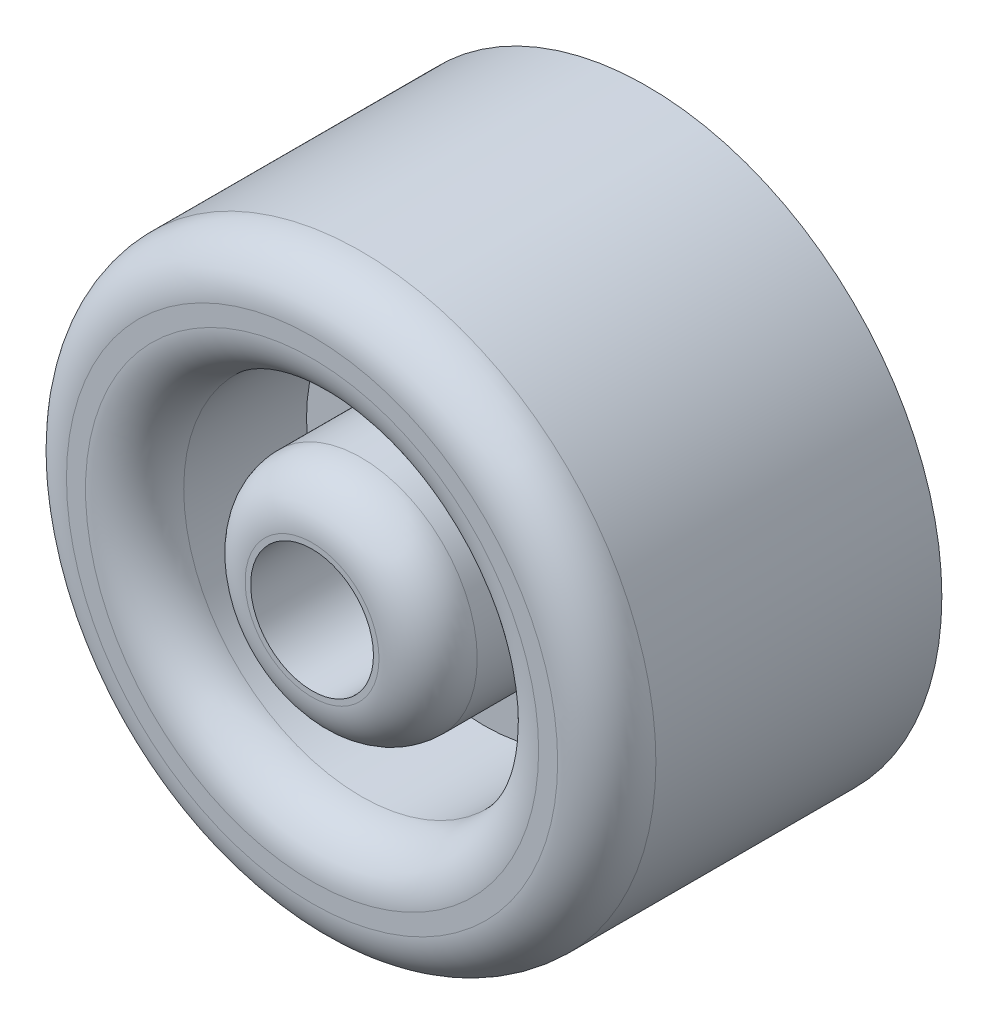
ISO-10303-21;
HEADER;
FILE_DESCRIPTION(('STEP AP214'),'2;1');
FILE_NAME('part.step','',(''),(''),'','','');
FILE_SCHEMA(('AUTOMOTIVE_DESIGN { 1 0 10303 214 1 1 1 1 }'));
ENDSEC;
DATA;
#1=APPLICATION_CONTEXT('core data for automotive mechanical design processes');
#2=APPLICATION_PROTOCOL_DEFINITION('international standard','automotive_design',2000,#1);
#3=PRODUCT_CONTEXT('',#1,'mechanical');
#4=PRODUCT('Part','Part','',(#3));
#5=PRODUCT_RELATED_PRODUCT_CATEGORY('part','',(#4));
#6=PRODUCT_DEFINITION_FORMATION('','',#4);
#7=PRODUCT_DEFINITION_CONTEXT('part definition',#1,'design');
#8=PRODUCT_DEFINITION('design','',#6,#7);
#9=PRODUCT_DEFINITION_SHAPE('','',#8);
#10=(LENGTH_UNIT() NAMED_UNIT(*) SI_UNIT(.MILLI.,.METRE.));
#11=(NAMED_UNIT(*) PLANE_ANGLE_UNIT() SI_UNIT($,.RADIAN.));
#12=(NAMED_UNIT(*) SI_UNIT($,.STERADIAN.) SOLID_ANGLE_UNIT());
#13=UNCERTAINTY_MEASURE_WITH_UNIT(LENGTH_MEASURE(1.E-05),#10,'distance_accuracy_value','');
#14=(GEOMETRIC_REPRESENTATION_CONTEXT(3) GLOBAL_UNCERTAINTY_ASSIGNED_CONTEXT((#13)) GLOBAL_UNIT_ASSIGNED_CONTEXT((#10,
#11,#12)) REPRESENTATION_CONTEXT('',''));
#15=CARTESIAN_POINT('',(0.,0.,0.));
#16=DIRECTION('',(0.,0.,1.));
#17=DIRECTION('',(1.,0.,0.));
#18=AXIS2_PLACEMENT_3D('',#15,#16,#17);
#19=CARTESIAN_POINT('',(420.000000000003,655.,35.2205449361843));
#20=DIRECTION('',(0.,0.,1.));
#21=DIRECTION('',(1.,0.,0.));
#22=AXIS2_PLACEMENT_3D('',#19,#20,#21);
#23=CYLINDRICAL_SURFACE('',#22,11.9999999999999);
#24=CARTESIAN_POINT('',(420.000000000003,655.,20.1259894105528));
#25=DIRECTION('',(0.,0.,1.));
#26=DIRECTION('',(1.,0.,0.));
#27=AXIS2_PLACEMENT_3D('',#24,#25,#26);
#28=CIRCLE('',#27,11.9999999999999);
#29=CARTESIAN_POINT('',(432.000000000003,655.,20.1259894105528));
#30=VERTEX_POINT('',#29);
#31=EDGE_CURVE('E75',#30,#30,#28,.T.);
#32=ORIENTED_EDGE('',*,*,#31,.T.);
#33=EDGE_LOOP('',(#32));
#34=FACE_BOUND('',#33,.T.);
#35=CARTESIAN_POINT('',(420.000000000003,655.,31.7691453664121));
#36=DIRECTION('',(0.,0.,1.));
#37=DIRECTION('',(1.,0.,0.));
#38=AXIS2_PLACEMENT_3D('',#35,#36,#37);
#39=CIRCLE('',#38,11.9999999999999);
#40=CARTESIAN_POINT('',(432.000000000003,655.,31.7691453664121));
#41=VERTEX_POINT('',#40);
#42=EDGE_CURVE('E10',#41,#41,#39,.T.);
#43=ORIENTED_EDGE('',*,*,#42,.F.);
#44=EDGE_LOOP('',(#43));
#45=FACE_BOUND('',#44,.T.);
#46=ADVANCED_FACE('F32',(#34,#45),#23,.T.);
#47=CARTESIAN_POINT('',(420.000000000003,655.,31.7691453664121));
#48=DIRECTION('',(0.,0.,1.));
#49=DIRECTION('',(1.,0.,0.));
#50=AXIS2_PLACEMENT_3D('',#47,#48,#49);
#51=TOROIDAL_SURFACE('',#50,9.9999999999999,2.);
#52=ORIENTED_EDGE('',*,*,#42,.T.);
#53=EDGE_LOOP('',(#52));
#54=FACE_BOUND('',#53,.T.);
#55=CARTESIAN_POINT('',(420.000000000003,655.,33.7691453664121));
#56=DIRECTION('',(0.,0.,1.));
#57=DIRECTION('',(1.,0.,0.));
#58=AXIS2_PLACEMENT_3D('',#55,#56,#57);
#59=CIRCLE('',#58,9.9999999999999);
#60=CARTESIAN_POINT('',(430.000000000003,655.,33.7691453664121));
#61=VERTEX_POINT('',#60);
#62=EDGE_CURVE('E38',#61,#61,#59,.T.);
#63=ORIENTED_EDGE('',*,*,#62,.F.);
#64=EDGE_LOOP('',(#63));
#65=FACE_BOUND('',#64,.T.);
#66=ADVANCED_FACE('F93',(#54,#65),#51,.T.);
#67=CARTESIAN_POINT('',(430.000000000003,655.,33.7691453664121));
#68=DIRECTION('',(0.,0.,1.));
#69=DIRECTION('',(1.,0.,0.));
#70=AXIS2_PLACEMENT_3D('',#67,#68,#69);
#71=PLANE('',#70);
#72=ORIENTED_EDGE('',*,*,#62,.T.);
#73=EDGE_LOOP('',(#72));
#74=FACE_BOUND('',#73,.T.);
#75=CARTESIAN_POINT('',(420.000000000003,655.,33.7691453664121));
#76=DIRECTION('',(0.,0.,1.));
#77=DIRECTION('',(1.,0.,0.));
#78=AXIS2_PLACEMENT_3D('',#75,#76,#77);
#79=CIRCLE('',#78,9.22547934031753);
#80=CARTESIAN_POINT('',(429.225479340321,655.,33.7691453664121));
#81=VERTEX_POINT('',#80);
#82=EDGE_CURVE('E42',#81,#81,#79,.T.);
#83=ORIENTED_EDGE('',*,*,#82,.F.);
#84=EDGE_LOOP('',(#83));
#85=FACE_BOUND('',#84,.T.);
#86=ADVANCED_FACE('F97',(#74,#85),#71,.T.);
#87=CARTESIAN_POINT('',(420.000000000003,655.,31.7691453664121));
#88=DIRECTION('',(0.,0.,1.));
#89=DIRECTION('',(1.,0.,0.));
#90=AXIS2_PLACEMENT_3D('',#87,#88,#89);
#91=TOROIDAL_SURFACE('',#90,9.22547934031753,2.);
#92=ORIENTED_EDGE('',*,*,#82,.T.);
#93=EDGE_LOOP('',(#92));
#94=FACE_BOUND('',#93,.T.);
#95=CARTESIAN_POINT('',(420.000000000003,655.,31.7691453664121));
#96=DIRECTION('',(0.,0.,1.));
#97=DIRECTION('',(1.,0.,0.));
#98=AXIS2_PLACEMENT_3D('',#95,#96,#97);
#99=CIRCLE('',#98,7.22547934031753);
#100=CARTESIAN_POINT('',(427.225479340321,655.,31.7691453664121));
#101=VERTEX_POINT('',#100);
#102=EDGE_CURVE('E46',#101,#101,#99,.T.);
#103=ORIENTED_EDGE('',*,*,#102,.F.);
#104=EDGE_LOOP('',(#103));
#105=FACE_BOUND('',#104,.T.);
#106=ADVANCED_FACE('F101',(#94,#105),#91,.T.);
#107=CARTESIAN_POINT('',(420.000000000003,655.,35.2205449361843));
#108=DIRECTION('',(0.,0.,1.));
#109=DIRECTION('',(1.,0.,0.));
#110=AXIS2_PLACEMENT_3D('',#107,#108,#109);
#111=CYLINDRICAL_SURFACE('',#110,7.22547934031753);
#112=ORIENTED_EDGE('',*,*,#102,.T.);
#113=EDGE_LOOP('',(#112));
#114=FACE_BOUND('',#113,.T.);
#115=CARTESIAN_POINT('',(420.000000000003,655.,26.7691453664121));
#116=DIRECTION('',(0.,0.,1.));
#117=DIRECTION('',(1.,0.,0.));
#118=AXIS2_PLACEMENT_3D('',#115,#116,#117);
#119=CIRCLE('',#118,7.22547934031753);
#120=CARTESIAN_POINT('',(427.225479340321,655.,26.7691453664121));
#121=VERTEX_POINT('',#120);
#122=EDGE_CURVE('E51',#121,#121,#119,.T.);
#123=ORIENTED_EDGE('',*,*,#122,.F.);
#124=EDGE_LOOP('',(#123));
#125=FACE_BOUND('',#124,.T.);
#126=ADVANCED_FACE('F107',(#114,#125),#111,.F.);
#127=CARTESIAN_POINT('',(427.225479340321,655.,26.7691453664121));
#128=DIRECTION('',(0.,0.,1.));
#129=DIRECTION('',(1.,0.,0.));
#130=AXIS2_PLACEMENT_3D('',#127,#128,#129);
#131=PLANE('',#130);
#132=ORIENTED_EDGE('',*,*,#122,.T.);
#133=EDGE_LOOP('',(#132));
#134=FACE_BOUND('',#133,.T.);
#135=CARTESIAN_POINT('',(420.000000000003,655.,26.7691453664121));
#136=DIRECTION('',(0.,0.,1.));
#137=DIRECTION('',(1.,0.,0.));
#138=AXIS2_PLACEMENT_3D('',#135,#136,#137);
#139=CIRCLE('',#138,4.72547934031753);
#140=CARTESIAN_POINT('',(424.725479340321,655.,26.7691453664121));
#141=VERTEX_POINT('',#140);
#142=EDGE_CURVE('E54',#141,#141,#139,.T.);
#143=ORIENTED_EDGE('',*,*,#142,.F.);
#144=EDGE_LOOP('',(#143));
#145=FACE_BOUND('',#144,.T.);
#146=ADVANCED_FACE('F111',(#134,#145),#131,.T.);
#147=CARTESIAN_POINT('',(420.000000000003,655.,35.2205449361843));
#148=DIRECTION('',(0.,0.,1.));
#149=DIRECTION('',(1.,0.,0.));
#150=AXIS2_PLACEMENT_3D('',#147,#148,#149);
#151=CYLINDRICAL_SURFACE('',#150,4.72547934031753);
#152=ORIENTED_EDGE('',*,*,#142,.T.);
#153=EDGE_LOOP('',(#152));
#154=FACE_BOUND('',#153,.T.);
#155=CARTESIAN_POINT('',(420.000000000003,655.,31.7691453664121));
#156=DIRECTION('',(0.,0.,1.));
#157=DIRECTION('',(1.,0.,0.));
#158=AXIS2_PLACEMENT_3D('',#155,#156,#157);
#159=CIRCLE('',#158,4.72547934031753);
#160=CARTESIAN_POINT('',(424.725479340321,655.,31.7691453664121));
#161=VERTEX_POINT('',#160);
#162=EDGE_CURVE('E57',#161,#161,#159,.T.);
#163=ORIENTED_EDGE('',*,*,#162,.F.);
#164=EDGE_LOOP('',(#163));
#165=FACE_BOUND('',#164,.T.);
#166=ADVANCED_FACE('F115',(#154,#165),#151,.T.);
#167=CARTESIAN_POINT('',(420.000000000003,655.,31.7691453664121));
#168=DIRECTION('',(0.,0.,1.));
#169=DIRECTION('',(1.,0.,0.));
#170=AXIS2_PLACEMENT_3D('',#167,#168,#169);
#171=TOROIDAL_SURFACE('',#170,2.72547934031753,2.);
#172=ORIENTED_EDGE('',*,*,#162,.T.);
#173=EDGE_LOOP('',(#172));
#174=FACE_BOUND('',#173,.T.);
#175=CARTESIAN_POINT('',(420.000000000003,655.,33.7691453664121));
#176=DIRECTION('',(0.,0.,1.));
#177=DIRECTION('',(1.,0.,0.));
#178=AXIS2_PLACEMENT_3D('',#175,#176,#177);
#179=CIRCLE('',#178,2.72547934031753);
#180=CARTESIAN_POINT('',(422.725479340321,655.,33.7691453664121));
#181=VERTEX_POINT('',#180);
#182=EDGE_CURVE('E60',#181,#181,#179,.T.);
#183=ORIENTED_EDGE('',*,*,#182,.F.);
#184=EDGE_LOOP('',(#183));
#185=FACE_BOUND('',#184,.T.);
#186=ADVANCED_FACE('F119',(#174,#185),#171,.T.);
#187=CARTESIAN_POINT('',(422.725479340321,655.,33.7691453664121));
#188=DIRECTION('',(0.,0.,1.));
#189=DIRECTION('',(1.,0.,0.));
#190=AXIS2_PLACEMENT_3D('',#187,#188,#189);
#191=PLANE('',#190);
#192=ORIENTED_EDGE('',*,*,#182,.T.);
#193=EDGE_LOOP('',(#192));
#194=FACE_BOUND('',#193,.T.);
#195=CARTESIAN_POINT('',(420.000000000003,655.,33.7691453664121));
#196=DIRECTION('',(0.,0.,1.));
#197=DIRECTION('',(1.,0.,0.));
#198=AXIS2_PLACEMENT_3D('',#195,#196,#197);
#199=CIRCLE('',#198,2.5);
#200=CARTESIAN_POINT('',(422.500000000003,655.,33.7691453664121));
#201=VERTEX_POINT('',#200);
#202=EDGE_CURVE('E63',#201,#201,#199,.T.);
#203=ORIENTED_EDGE('',*,*,#202,.F.);
#204=EDGE_LOOP('',(#203));
#205=FACE_BOUND('',#204,.T.);
#206=ADVANCED_FACE('F123',(#194,#205),#191,.T.);
#207=CARTESIAN_POINT('',(420.000000000003,655.,35.2205449361843));
#208=DIRECTION('',(0.,0.,1.));
#209=DIRECTION('',(1.,0.,0.));
#210=AXIS2_PLACEMENT_3D('',#207,#208,#209);
#211=CYLINDRICAL_SURFACE('',#210,2.5);
#212=ORIENTED_EDGE('',*,*,#202,.T.);
#213=EDGE_LOOP('',(#212));
#214=FACE_BOUND('',#213,.T.);
#215=CARTESIAN_POINT('',(420.000000000003,655.,24.7691453664121));
#216=DIRECTION('',(0.,0.,1.));
#217=DIRECTION('',(1.,0.,0.));
#218=AXIS2_PLACEMENT_3D('',#215,#216,#217);
#219=CIRCLE('',#218,2.5);
#220=CARTESIAN_POINT('',(422.500000000003,655.,24.7691453664121));
#221=VERTEX_POINT('',#220);
#222=EDGE_CURVE('E66',#221,#221,#219,.T.);
#223=ORIENTED_EDGE('',*,*,#222,.F.);
#224=EDGE_LOOP('',(#223));
#225=FACE_BOUND('',#224,.T.);
#226=ADVANCED_FACE('F127',(#214,#225),#211,.F.);
#227=CARTESIAN_POINT('',(422.500000000003,655.,24.7691453664121));
#228=DIRECTION('',(0.,0.,-1.));
#229=DIRECTION('',(-1.,0.,0.));
#230=AXIS2_PLACEMENT_3D('',#227,#228,#229);
#231=PLANE('',#230);
#232=ORIENTED_EDGE('',*,*,#222,.T.);
#233=EDGE_LOOP('',(#232));
#234=FACE_BOUND('',#233,.T.);
#235=CARTESIAN_POINT('',(420.000000000003,655.,24.7691453664121));
#236=DIRECTION('',(0.,0.,1.));
#237=DIRECTION('',(1.,0.,0.));
#238=AXIS2_PLACEMENT_3D('',#235,#236,#237);
#239=CIRCLE('',#238,8.4999999999999);
#240=CARTESIAN_POINT('',(428.500000000003,655.,24.7691453664121));
#241=VERTEX_POINT('',#240);
#242=EDGE_CURVE('E69',#241,#241,#239,.T.);
#243=ORIENTED_EDGE('',*,*,#242,.F.);
#244=EDGE_LOOP('',(#243));
#245=FACE_BOUND('',#244,.T.);
#246=ADVANCED_FACE('F89',(#234,#245),#231,.T.);
#247=CARTESIAN_POINT('',(420.000000000003,655.,35.2205449361843));
#248=DIRECTION('',(0.,0.,1.));
#249=DIRECTION('',(1.,0.,0.));
#250=AXIS2_PLACEMENT_3D('',#247,#248,#249);
#251=CYLINDRICAL_SURFACE('',#250,8.4999999999999);
#252=ORIENTED_EDGE('',*,*,#242,.T.);
#253=EDGE_LOOP('',(#252));
#254=FACE_BOUND('',#253,.T.);
#255=CARTESIAN_POINT('',(420.000000000003,655.,20.1259894105528));
#256=DIRECTION('',(0.,0.,1.));
#257=DIRECTION('',(1.,0.,0.));
#258=AXIS2_PLACEMENT_3D('',#255,#256,#257);
#259=CIRCLE('',#258,8.4999999999999);
#260=CARTESIAN_POINT('',(428.500000000003,655.,20.1259894105528));
#261=VERTEX_POINT('',#260);
#262=EDGE_CURVE('E72',#261,#261,#259,.T.);
#263=ORIENTED_EDGE('',*,*,#262,.F.);
#264=EDGE_LOOP('',(#263));
#265=FACE_BOUND('',#264,.T.);
#266=ADVANCED_FACE('F83',(#254,#265),#251,.F.);
#267=CARTESIAN_POINT('',(428.500000000003,655.,20.1259894105528));
#268=DIRECTION('',(0.,0.,-1.));
#269=DIRECTION('',(-1.,0.,0.));
#270=AXIS2_PLACEMENT_3D('',#267,#268,#269);
#271=PLANE('',#270);
#272=ORIENTED_EDGE('',*,*,#262,.T.);
#273=EDGE_LOOP('',(#272));
#274=FACE_BOUND('',#273,.T.);
#275=ORIENTED_EDGE('',*,*,#31,.F.);
#276=EDGE_LOOP('',(#275));
#277=FACE_BOUND('',#276,.T.);
#278=ADVANCED_FACE('F81',(#274,#277),#271,.T.);
#279=CLOSED_SHELL('',(#46,#66,#86,#106,#126,#146,#166,#186,#206,#226,#246,#266,#278));
#280=MANIFOLD_SOLID_BREP('B2',#279);
#281=ADVANCED_BREP_SHAPE_REPRESENTATION('',(#18,#280),#14);
#282=SHAPE_DEFINITION_REPRESENTATION(#9,#281);
ENDSEC;
END-ISO-10303-21;
